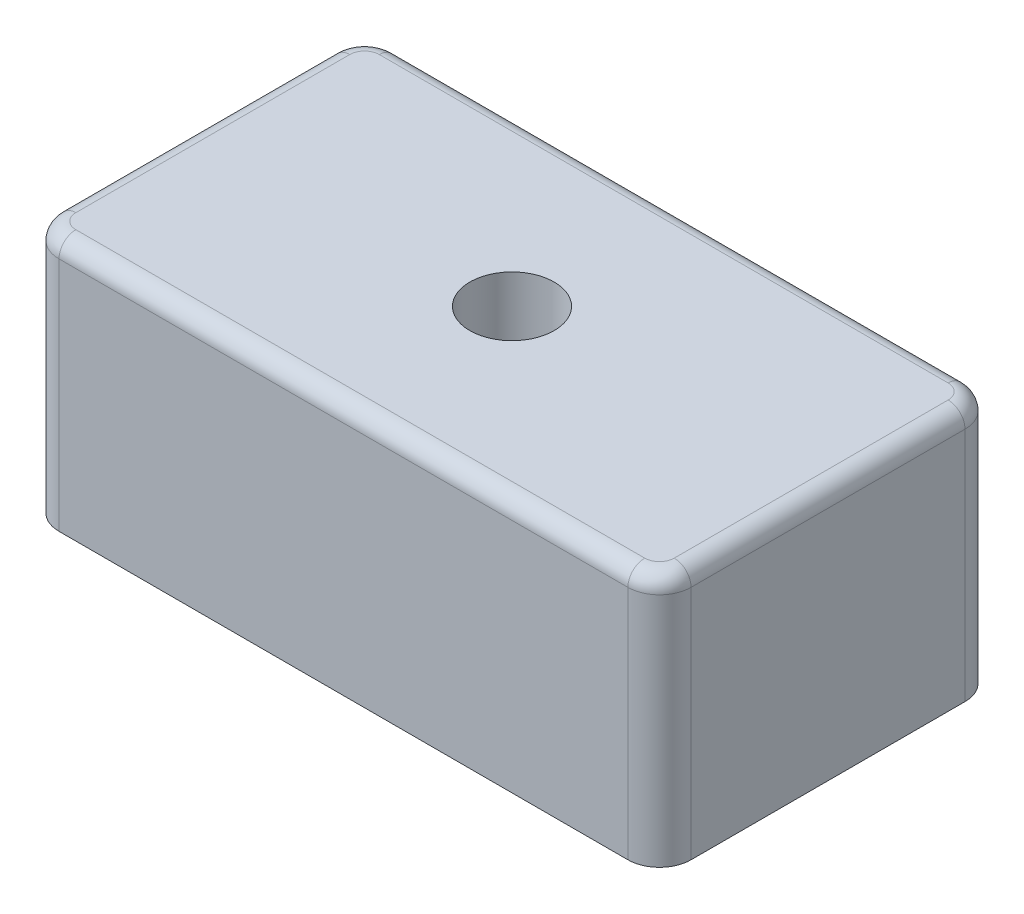
ISO-10303-21;
HEADER;
FILE_DESCRIPTION(('STEP AP214'),'2;1');
FILE_NAME('part.step','',(''),(''),'','','');
FILE_SCHEMA(('AUTOMOTIVE_DESIGN { 1 0 10303 214 1 1 1 1 }'));
ENDSEC;
DATA;
#1=APPLICATION_CONTEXT('core data for automotive mechanical design processes');
#2=APPLICATION_PROTOCOL_DEFINITION('international standard','automotive_design',2000,#1);
#3=PRODUCT_CONTEXT('',#1,'mechanical');
#4=PRODUCT('Part','Part','',(#3));
#5=PRODUCT_RELATED_PRODUCT_CATEGORY('part','',(#4));
#6=PRODUCT_DEFINITION_FORMATION('','',#4);
#7=PRODUCT_DEFINITION_CONTEXT('part definition',#1,'design');
#8=PRODUCT_DEFINITION('design','',#6,#7);
#9=PRODUCT_DEFINITION_SHAPE('','',#8);
#10=(LENGTH_UNIT() NAMED_UNIT(*) SI_UNIT(.MILLI.,.METRE.));
#11=(NAMED_UNIT(*) PLANE_ANGLE_UNIT() SI_UNIT($,.RADIAN.));
#12=(NAMED_UNIT(*) SI_UNIT($,.STERADIAN.) SOLID_ANGLE_UNIT());
#13=UNCERTAINTY_MEASURE_WITH_UNIT(LENGTH_MEASURE(1.E-05),#10,'distance_accuracy_value','');
#14=(GEOMETRIC_REPRESENTATION_CONTEXT(3) GLOBAL_UNCERTAINTY_ASSIGNED_CONTEXT((#13)) GLOBAL_UNIT_ASSIGNED_CONTEXT((#10,
#11,#12)) REPRESENTATION_CONTEXT('',''));
#15=CARTESIAN_POINT('',(0.,0.,0.));
#16=DIRECTION('',(0.,0.,1.));
#17=DIRECTION('',(1.,0.,0.));
#18=AXIS2_PLACEMENT_3D('',#15,#16,#17);
#19=CARTESIAN_POINT('',(15.,12.,-8.));
#20=DIRECTION('',(-1.,0.,0.));
#21=DIRECTION('',(0.,0.,1.));
#22=AXIS2_PLACEMENT_3D('',#19,#20,#21);
#23=PLANE('',#22);
#24=DIRECTION('',(0.,-1.,0.));
#25=VECTOR('',#24,1.);
#26=CARTESIAN_POINT('',(15.,12.,-6.5));
#27=LINE('',#26,#25);
#28=CARTESIAN_POINT('',(15.,0.,-6.5));
#29=VERTEX_POINT('',#28);
#30=CARTESIAN_POINT('',(15.,11.2,-6.5));
#31=VERTEX_POINT('',#30);
#32=EDGE_CURVE('E179',#29,#31,#27,.F.);
#33=ORIENTED_EDGE('',*,*,#32,.T.);
#34=DIRECTION('',(0.,0.,-1.));
#35=VECTOR('',#34,1.);
#36=CARTESIAN_POINT('',(15.,11.2,6.5));
#37=LINE('',#36,#35);
#38=CARTESIAN_POINT('',(15.,11.2,6.5));
#39=VERTEX_POINT('',#38);
#40=EDGE_CURVE('E50',#31,#39,#37,.F.);
#41=ORIENTED_EDGE('',*,*,#40,.T.);
#42=DIRECTION('',(0.,-1.,0.));
#43=VECTOR('',#42,1.);
#44=CARTESIAN_POINT('',(15.,12.,6.5));
#45=LINE('',#44,#43);
#46=CARTESIAN_POINT('',(15.,0.,6.5));
#47=VERTEX_POINT('',#46);
#48=EDGE_CURVE('E177',#39,#47,#45,.T.);
#49=ORIENTED_EDGE('',*,*,#48,.T.);
#50=DIRECTION('',(0.,0.,-1.));
#51=VECTOR('',#50,1.);
#52=CARTESIAN_POINT('',(15.,0.,-8.));
#53=LINE('',#52,#51);
#54=EDGE_CURVE('E241',#47,#29,#53,.T.);
#55=ORIENTED_EDGE('',*,*,#54,.T.);
#56=EDGE_LOOP('',(#33,#41,#49,#55));
#57=FACE_BOUND('',#56,.T.);
#58=ADVANCED_FACE('F41',(#57),#23,.F.);
#59=CARTESIAN_POINT('',(-15.,12.,-8.));
#60=DIRECTION('',(0.,0.,1.));
#61=DIRECTION('',(1.,0.,0.));
#62=AXIS2_PLACEMENT_3D('',#59,#60,#61);
#63=PLANE('',#62);
#64=DIRECTION('',(0.,-1.,0.));
#65=VECTOR('',#64,1.);
#66=CARTESIAN_POINT('',(-13.5,12.,-8.));
#67=LINE('',#66,#65);
#68=CARTESIAN_POINT('',(-13.5,0.,-8.));
#69=VERTEX_POINT('',#68);
#70=CARTESIAN_POINT('',(-13.5,11.2,-8.));
#71=VERTEX_POINT('',#70);
#72=EDGE_CURVE('E175',#69,#71,#67,.F.);
#73=ORIENTED_EDGE('',*,*,#72,.T.);
#74=DIRECTION('',(-1.,0.,0.));
#75=VECTOR('',#74,1.);
#76=CARTESIAN_POINT('',(13.5,11.2,-8.));
#77=LINE('',#76,#75);
#78=CARTESIAN_POINT('',(13.5,11.2,-8.));
#79=VERTEX_POINT('',#78);
#80=EDGE_CURVE('E11',#71,#79,#77,.F.);
#81=ORIENTED_EDGE('',*,*,#80,.T.);
#82=DIRECTION('',(0.,-1.,0.));
#83=VECTOR('',#82,1.);
#84=CARTESIAN_POINT('',(13.5,12.,-8.));
#85=LINE('',#84,#83);
#86=CARTESIAN_POINT('',(13.5,0.,-8.));
#87=VERTEX_POINT('',#86);
#88=EDGE_CURVE('E173',#79,#87,#85,.T.);
#89=ORIENTED_EDGE('',*,*,#88,.T.);
#90=DIRECTION('',(-1.,0.,0.));
#91=VECTOR('',#90,1.);
#92=CARTESIAN_POINT('',(-15.,0.,-8.));
#93=LINE('',#92,#91);
#94=EDGE_CURVE('E163',#87,#69,#93,.T.);
#95=ORIENTED_EDGE('',*,*,#94,.T.);
#96=EDGE_LOOP('',(#73,#81,#89,#95));
#97=FACE_BOUND('',#96,.T.);
#98=ADVANCED_FACE('F248',(#97),#63,.F.);
#99=CARTESIAN_POINT('',(-15.,12.,-8.));
#100=DIRECTION('',(1.,0.,0.));
#101=DIRECTION('',(0.,0.,-1.));
#102=AXIS2_PLACEMENT_3D('',#99,#100,#101);
#103=PLANE('',#102);
#104=DIRECTION('',(0.,-1.,0.));
#105=VECTOR('',#104,1.);
#106=CARTESIAN_POINT('',(-15.,12.,6.5));
#107=LINE('',#106,#105);
#108=CARTESIAN_POINT('',(-15.,0.,6.5));
#109=VERTEX_POINT('',#108);
#110=CARTESIAN_POINT('',(-15.,11.2,6.5));
#111=VERTEX_POINT('',#110);
#112=EDGE_CURVE('E150',#109,#111,#107,.F.);
#113=ORIENTED_EDGE('',*,*,#112,.T.);
#114=DIRECTION('',(0.,0.,1.));
#115=VECTOR('',#114,1.);
#116=CARTESIAN_POINT('',(-15.,11.2,-6.5));
#117=LINE('',#116,#115);
#118=CARTESIAN_POINT('',(-15.,11.2,-6.5));
#119=VERTEX_POINT('',#118);
#120=EDGE_CURVE('E58',#111,#119,#117,.F.);
#121=ORIENTED_EDGE('',*,*,#120,.T.);
#122=DIRECTION('',(0.,-1.,0.));
#123=VECTOR('',#122,1.);
#124=CARTESIAN_POINT('',(-15.,12.,-6.5));
#125=LINE('',#124,#123);
#126=CARTESIAN_POINT('',(-15.,0.,-6.5));
#127=VERTEX_POINT('',#126);
#128=EDGE_CURVE('E154',#119,#127,#125,.T.);
#129=ORIENTED_EDGE('',*,*,#128,.T.);
#130=DIRECTION('',(0.,0.,1.));
#131=VECTOR('',#130,1.);
#132=CARTESIAN_POINT('',(-15.,0.,-8.));
#133=LINE('',#132,#131);
#134=EDGE_CURVE('E160',#127,#109,#133,.T.);
#135=ORIENTED_EDGE('',*,*,#134,.T.);
#136=EDGE_LOOP('',(#113,#121,#129,#135));
#137=FACE_BOUND('',#136,.T.);
#138=ADVANCED_FACE('F255',(#137),#103,.F.);
#139=CARTESIAN_POINT('',(-15.,12.,8.));
#140=DIRECTION('',(0.,0.,-1.));
#141=DIRECTION('',(-1.,0.,0.));
#142=AXIS2_PLACEMENT_3D('',#139,#140,#141);
#143=PLANE('',#142);
#144=DIRECTION('',(0.,-1.,0.));
#145=VECTOR('',#144,1.);
#146=CARTESIAN_POINT('',(13.5,12.,8.));
#147=LINE('',#146,#145);
#148=CARTESIAN_POINT('',(13.5,0.,8.));
#149=VERTEX_POINT('',#148);
#150=CARTESIAN_POINT('',(13.5,11.2,8.));
#151=VERTEX_POINT('',#150);
#152=EDGE_CURVE('E145',#149,#151,#147,.F.);
#153=ORIENTED_EDGE('',*,*,#152,.T.);
#154=DIRECTION('',(1.,0.,0.));
#155=VECTOR('',#154,1.);
#156=CARTESIAN_POINT('',(-13.5,11.2,8.));
#157=LINE('',#156,#155);
#158=CARTESIAN_POINT('',(-13.5,11.2,8.));
#159=VERTEX_POINT('',#158);
#160=EDGE_CURVE('E141',#151,#159,#157,.F.);
#161=ORIENTED_EDGE('',*,*,#160,.T.);
#162=DIRECTION('',(0.,-1.,0.));
#163=VECTOR('',#162,1.);
#164=CARTESIAN_POINT('',(-13.5,12.,8.));
#165=LINE('',#164,#163);
#166=CARTESIAN_POINT('',(-13.5,0.,8.));
#167=VERTEX_POINT('',#166);
#168=EDGE_CURVE('E133',#159,#167,#165,.T.);
#169=ORIENTED_EDGE('',*,*,#168,.T.);
#170=DIRECTION('',(1.,0.,0.));
#171=VECTOR('',#170,1.);
#172=CARTESIAN_POINT('',(-15.,0.,8.));
#173=LINE('',#172,#171);
#174=EDGE_CURVE('E138',#167,#149,#173,.T.);
#175=ORIENTED_EDGE('',*,*,#174,.T.);
#176=EDGE_LOOP('',(#153,#161,#169,#175));
#177=FACE_BOUND('',#176,.T.);
#178=ADVANCED_FACE('F136',(#177),#143,.F.);
#179=CARTESIAN_POINT('',(0.,12.,0.));
#180=DIRECTION('',(0.,1.,0.));
#181=DIRECTION('',(0.,0.,1.));
#182=AXIS2_PLACEMENT_3D('',#179,#180,#181);
#183=PLANE('',#182);
#184=CARTESIAN_POINT('',(-13.5,12.,6.5));
#185=DIRECTION('',(0.,1.,0.));
#186=DIRECTION('',(0.,0.,1.));
#187=AXIS2_PLACEMENT_3D('',#184,#185,#186);
#188=CIRCLE('',#187,0.7);
#189=CARTESIAN_POINT('',(-14.2,12.,6.5));
#190=VERTEX_POINT('',#189);
#191=CARTESIAN_POINT('',(-13.5,12.,7.2));
#192=VERTEX_POINT('',#191);
#193=EDGE_CURVE('E193',#190,#192,#188,.T.);
#194=ORIENTED_EDGE('',*,*,#193,.T.);
#195=DIRECTION('',(1.,0.,0.));
#196=VECTOR('',#195,1.);
#197=CARTESIAN_POINT('',(13.5,12.,7.2));
#198=LINE('',#197,#196);
#199=CARTESIAN_POINT('',(13.5,12.,7.2));
#200=VERTEX_POINT('',#199);
#201=EDGE_CURVE('E197',#192,#200,#198,.T.);
#202=ORIENTED_EDGE('',*,*,#201,.T.);
#203=CARTESIAN_POINT('',(13.5,12.,6.5));
#204=DIRECTION('',(0.,1.,0.));
#205=DIRECTION('',(0.,0.,1.));
#206=AXIS2_PLACEMENT_3D('',#203,#204,#205);
#207=CIRCLE('',#206,0.7);
#208=CARTESIAN_POINT('',(14.2,12.,6.5));
#209=VERTEX_POINT('',#208);
#210=EDGE_CURVE('E195',#200,#209,#207,.T.);
#211=ORIENTED_EDGE('',*,*,#210,.T.);
#212=DIRECTION('',(0.,0.,-1.));
#213=VECTOR('',#212,1.);
#214=CARTESIAN_POINT('',(14.2,12.,-6.5));
#215=LINE('',#214,#213);
#216=CARTESIAN_POINT('',(14.2,12.,-6.5));
#217=VERTEX_POINT('',#216);
#218=EDGE_CURVE('E189',#209,#217,#215,.T.);
#219=ORIENTED_EDGE('',*,*,#218,.T.);
#220=CARTESIAN_POINT('',(13.5,12.,-6.5));
#221=DIRECTION('',(0.,1.,0.));
#222=DIRECTION('',(0.,0.,1.));
#223=AXIS2_PLACEMENT_3D('',#220,#221,#222);
#224=CIRCLE('',#223,0.7);
#225=CARTESIAN_POINT('',(13.5,12.,-7.2));
#226=VERTEX_POINT('',#225);
#227=EDGE_CURVE('E186',#217,#226,#224,.T.);
#228=ORIENTED_EDGE('',*,*,#227,.T.);
#229=DIRECTION('',(-1.,0.,0.));
#230=VECTOR('',#229,1.);
#231=CARTESIAN_POINT('',(-13.5,12.,-7.2));
#232=LINE('',#231,#230);
#233=CARTESIAN_POINT('',(-13.5,12.,-7.2));
#234=VERTEX_POINT('',#233);
#235=EDGE_CURVE('E182',#226,#234,#232,.T.);
#236=ORIENTED_EDGE('',*,*,#235,.T.);
#237=CARTESIAN_POINT('',(-13.5,12.,-6.5));
#238=DIRECTION('',(0.,1.,0.));
#239=DIRECTION('',(0.,0.,1.));
#240=AXIS2_PLACEMENT_3D('',#237,#238,#239);
#241=CIRCLE('',#240,0.7);
#242=CARTESIAN_POINT('',(-14.2,12.,-6.5));
#243=VERTEX_POINT('',#242);
#244=EDGE_CURVE('E184',#234,#243,#241,.T.);
#245=ORIENTED_EDGE('',*,*,#244,.T.);
#246=DIRECTION('',(0.,0.,1.));
#247=VECTOR('',#246,1.);
#248=CARTESIAN_POINT('',(-14.2,12.,6.5));
#249=LINE('',#248,#247);
#250=EDGE_CURVE('E191',#243,#190,#249,.T.);
#251=ORIENTED_EDGE('',*,*,#250,.T.);
#252=EDGE_LOOP('',(#194,#202,#211,#219,#228,#236,#245,#251));
#253=FACE_BOUND('',#252,.T.);
#254=CARTESIAN_POINT('',(0.,12.,0.));
#255=DIRECTION('',(0.,1.,0.));
#256=DIRECTION('',(0.,0.,1.));
#257=AXIS2_PLACEMENT_3D('',#254,#255,#256);
#258=CIRCLE('',#257,2.);
#259=CARTESIAN_POINT('',(0.,12.,2.));
#260=VERTEX_POINT('',#259);
#261=EDGE_CURVE('E231',#260,#260,#258,.T.);
#262=ORIENTED_EDGE('',*,*,#261,.F.);
#263=EDGE_LOOP('',(#262));
#264=FACE_BOUND('',#263,.T.);
#265=ADVANCED_FACE('F291',(#253,#264),#183,.T.);
#266=CARTESIAN_POINT('',(0.,0.,0.));
#267=DIRECTION('',(0.,1.,0.));
#268=DIRECTION('',(0.,0.,1.));
#269=AXIS2_PLACEMENT_3D('',#266,#267,#268);
#270=PLANE('',#269);
#271=CARTESIAN_POINT('',(0.,0.,0.));
#272=DIRECTION('',(0.,1.,0.));
#273=DIRECTION('',(0.,0.,1.));
#274=AXIS2_PLACEMENT_3D('',#271,#272,#273);
#275=CIRCLE('',#274,2.);
#276=CARTESIAN_POINT('',(0.,0.,2.));
#277=VERTEX_POINT('',#276);
#278=EDGE_CURVE('E236',#277,#277,#275,.T.);
#279=ORIENTED_EDGE('',*,*,#278,.T.);
#280=EDGE_LOOP('',(#279));
#281=FACE_BOUND('',#280,.T.);
#282=ORIENTED_EDGE('',*,*,#174,.F.);
#283=CARTESIAN_POINT('',(-13.5,0.,6.5));
#284=DIRECTION('',(0.,1.,0.));
#285=DIRECTION('',(0.,0.,1.));
#286=AXIS2_PLACEMENT_3D('',#283,#284,#285);
#287=CIRCLE('',#286,1.5);
#288=EDGE_CURVE('E148',#167,#109,#287,.F.);
#289=ORIENTED_EDGE('',*,*,#288,.T.);
#290=ORIENTED_EDGE('',*,*,#134,.F.);
#291=CARTESIAN_POINT('',(-13.5,0.,-6.5));
#292=DIRECTION('',(0.,1.,0.));
#293=DIRECTION('',(0.,0.,1.));
#294=AXIS2_PLACEMENT_3D('',#291,#292,#293);
#295=CIRCLE('',#294,1.5);
#296=EDGE_CURVE('E155',#127,#69,#295,.F.);
#297=ORIENTED_EDGE('',*,*,#296,.T.);
#298=ORIENTED_EDGE('',*,*,#94,.F.);
#299=CARTESIAN_POINT('',(13.5,0.,-6.5));
#300=DIRECTION('',(0.,1.,0.));
#301=DIRECTION('',(0.,0.,1.));
#302=AXIS2_PLACEMENT_3D('',#299,#300,#301);
#303=CIRCLE('',#302,1.5);
#304=EDGE_CURVE('E168',#87,#29,#303,.F.);
#305=ORIENTED_EDGE('',*,*,#304,.T.);
#306=ORIENTED_EDGE('',*,*,#54,.F.);
#307=CARTESIAN_POINT('',(13.5,0.,6.5));
#308=DIRECTION('',(0.,1.,0.));
#309=DIRECTION('',(0.,0.,1.));
#310=AXIS2_PLACEMENT_3D('',#307,#308,#309);
#311=CIRCLE('',#310,1.5);
#312=EDGE_CURVE('E144',#47,#149,#311,.F.);
#313=ORIENTED_EDGE('',*,*,#312,.T.);
#314=EDGE_LOOP('',(#282,#289,#290,#297,#298,#305,#306,#313));
#315=FACE_BOUND('',#314,.T.);
#316=ADVANCED_FACE('F157',(#281,#315),#270,.F.);
#317=CARTESIAN_POINT('',(0.,0.,0.));
#318=DIRECTION('',(0.,1.,0.));
#319=DIRECTION('',(0.,0.,1.));
#320=AXIS2_PLACEMENT_3D('',#317,#318,#319);
#321=CYLINDRICAL_SURFACE('',#320,2.);
#322=ORIENTED_EDGE('',*,*,#278,.F.);
#323=EDGE_LOOP('',(#322));
#324=FACE_BOUND('',#323,.T.);
#325=ORIENTED_EDGE('',*,*,#261,.T.);
#326=EDGE_LOOP('',(#325));
#327=FACE_BOUND('',#326,.T.);
#328=ADVANCED_FACE('F300',(#324,#327),#321,.F.);
#329=CARTESIAN_POINT('',(-13.5,12.,6.5));
#330=DIRECTION('',(0.,-1.,0.));
#331=DIRECTION('',(0.,0.,-1.));
#332=AXIS2_PLACEMENT_3D('',#329,#330,#331);
#333=CYLINDRICAL_SURFACE('',#332,1.5);
#334=ORIENTED_EDGE('',*,*,#168,.F.);
#335=CARTESIAN_POINT('',(-13.5,11.2,6.5));
#336=DIRECTION('',(0.,1.,0.));
#337=DIRECTION('',(0.,0.,1.));
#338=AXIS2_PLACEMENT_3D('',#335,#336,#337);
#339=CIRCLE('',#338,1.5);
#340=EDGE_CURVE('E204',#159,#111,#339,.F.);
#341=ORIENTED_EDGE('',*,*,#340,.T.);
#342=ORIENTED_EDGE('',*,*,#112,.F.);
#343=ORIENTED_EDGE('',*,*,#288,.F.);
#344=EDGE_LOOP('',(#334,#341,#342,#343));
#345=FACE_BOUND('',#344,.T.);
#346=ADVANCED_FACE('F149',(#345),#333,.T.);
#347=CARTESIAN_POINT('',(-13.5,12.,-6.5));
#348=DIRECTION('',(0.,-1.,0.));
#349=DIRECTION('',(0.,0.,-1.));
#350=AXIS2_PLACEMENT_3D('',#347,#348,#349);
#351=CYLINDRICAL_SURFACE('',#350,1.5);
#352=ORIENTED_EDGE('',*,*,#128,.F.);
#353=CARTESIAN_POINT('',(-13.5,11.2,-6.5));
#354=DIRECTION('',(0.,1.,0.));
#355=DIRECTION('',(0.,0.,1.));
#356=AXIS2_PLACEMENT_3D('',#353,#354,#355);
#357=CIRCLE('',#356,1.5);
#358=EDGE_CURVE('E65',#119,#71,#357,.F.);
#359=ORIENTED_EDGE('',*,*,#358,.T.);
#360=ORIENTED_EDGE('',*,*,#72,.F.);
#361=ORIENTED_EDGE('',*,*,#296,.F.);
#362=EDGE_LOOP('',(#352,#359,#360,#361));
#363=FACE_BOUND('',#362,.T.);
#364=ADVANCED_FACE('F253',(#363),#351,.T.);
#365=CARTESIAN_POINT('',(13.5,12.,-6.5));
#366=DIRECTION('',(0.,-1.,0.));
#367=DIRECTION('',(0.,0.,-1.));
#368=AXIS2_PLACEMENT_3D('',#365,#366,#367);
#369=CYLINDRICAL_SURFACE('',#368,1.5);
#370=ORIENTED_EDGE('',*,*,#88,.F.);
#371=CARTESIAN_POINT('',(13.5,11.2,-6.5));
#372=DIRECTION('',(0.,1.,0.));
#373=DIRECTION('',(0.,0.,1.));
#374=AXIS2_PLACEMENT_3D('',#371,#372,#373);
#375=CIRCLE('',#374,1.5);
#376=EDGE_CURVE('E199',#79,#31,#375,.F.);
#377=ORIENTED_EDGE('',*,*,#376,.T.);
#378=ORIENTED_EDGE('',*,*,#32,.F.);
#379=ORIENTED_EDGE('',*,*,#304,.F.);
#380=EDGE_LOOP('',(#370,#377,#378,#379));
#381=FACE_BOUND('',#380,.T.);
#382=ADVANCED_FACE('F269',(#381),#369,.T.);
#383=CARTESIAN_POINT('',(13.5,12.,6.5));
#384=DIRECTION('',(0.,-1.,0.));
#385=DIRECTION('',(0.,0.,-1.));
#386=AXIS2_PLACEMENT_3D('',#383,#384,#385);
#387=CYLINDRICAL_SURFACE('',#386,1.5);
#388=ORIENTED_EDGE('',*,*,#48,.F.);
#389=CARTESIAN_POINT('',(13.5,11.2,6.5));
#390=DIRECTION('',(0.,1.,0.));
#391=DIRECTION('',(0.,0.,1.));
#392=AXIS2_PLACEMENT_3D('',#389,#390,#391);
#393=CIRCLE('',#392,1.5);
#394=EDGE_CURVE('E202',#39,#151,#393,.F.);
#395=ORIENTED_EDGE('',*,*,#394,.T.);
#396=ORIENTED_EDGE('',*,*,#152,.F.);
#397=ORIENTED_EDGE('',*,*,#312,.F.);
#398=EDGE_LOOP('',(#388,#395,#396,#397));
#399=FACE_BOUND('',#398,.T.);
#400=ADVANCED_FACE('F284',(#399),#387,.T.);
#401=CARTESIAN_POINT('',(-13.5,11.2,6.5));
#402=DIRECTION('',(0.,1.,0.));
#403=DIRECTION('',(0.,0.,1.));
#404=AXIS2_PLACEMENT_3D('',#401,#402,#403);
#405=DEGENERATE_TOROIDAL_SURFACE('',#404,0.7,0.8,.T.);
#406=CARTESIAN_POINT('',(-14.2,11.2,6.5));
#407=DIRECTION('',(0.,0.,-1.));
#408=DIRECTION('',(-1.,0.,0.));
#409=AXIS2_PLACEMENT_3D('',#406,#407,#408);
#410=CIRCLE('',#409,0.8);
#411=EDGE_CURVE('E225',#111,#190,#410,.T.);
#412=ORIENTED_EDGE('',*,*,#411,.F.);
#413=ORIENTED_EDGE('',*,*,#340,.F.);
#414=CARTESIAN_POINT('',(-13.5,11.2,7.2));
#415=DIRECTION('',(1.,0.,0.));
#416=DIRECTION('',(0.,0.,-1.));
#417=AXIS2_PLACEMENT_3D('',#414,#415,#416);
#418=CIRCLE('',#417,0.8);
#419=EDGE_CURVE('E45',#192,#159,#418,.T.);
#420=ORIENTED_EDGE('',*,*,#419,.F.);
#421=ORIENTED_EDGE('',*,*,#193,.F.);
#422=EDGE_LOOP('',(#412,#413,#420,#421));
#423=FACE_BOUND('',#422,.T.);
#424=ADVANCED_FACE('F43',(#423),#405,.T.);
#425=CARTESIAN_POINT('',(0.,11.2,7.2));
#426=DIRECTION('',(-1.,0.,0.));
#427=DIRECTION('',(0.,0.,1.));
#428=AXIS2_PLACEMENT_3D('',#425,#426,#427);
#429=CYLINDRICAL_SURFACE('',#428,0.8);
#430=ORIENTED_EDGE('',*,*,#419,.T.);
#431=ORIENTED_EDGE('',*,*,#160,.F.);
#432=CARTESIAN_POINT('',(13.5,11.2,7.2));
#433=DIRECTION('',(1.,0.,0.));
#434=DIRECTION('',(0.,0.,-1.));
#435=AXIS2_PLACEMENT_3D('',#432,#433,#434);
#436=CIRCLE('',#435,0.8);
#437=EDGE_CURVE('E223',#200,#151,#436,.T.);
#438=ORIENTED_EDGE('',*,*,#437,.F.);
#439=ORIENTED_EDGE('',*,*,#201,.F.);
#440=EDGE_LOOP('',(#430,#431,#438,#439));
#441=FACE_BOUND('',#440,.T.);
#442=ADVANCED_FACE('F289',(#441),#429,.T.);
#443=CARTESIAN_POINT('',(-14.2,11.2,0.));
#444=DIRECTION('',(0.,0.,-1.));
#445=DIRECTION('',(-1.,0.,0.));
#446=AXIS2_PLACEMENT_3D('',#443,#444,#445);
#447=CYLINDRICAL_SURFACE('',#446,0.8);
#448=ORIENTED_EDGE('',*,*,#411,.T.);
#449=ORIENTED_EDGE('',*,*,#250,.F.);
#450=CARTESIAN_POINT('',(-14.2,11.2,-6.5));
#451=DIRECTION('',(0.,0.,-1.));
#452=DIRECTION('',(-1.,0.,0.));
#453=AXIS2_PLACEMENT_3D('',#450,#451,#452);
#454=CIRCLE('',#453,0.8);
#455=EDGE_CURVE('E220',#119,#243,#454,.T.);
#456=ORIENTED_EDGE('',*,*,#455,.F.);
#457=ORIENTED_EDGE('',*,*,#120,.F.);
#458=EDGE_LOOP('',(#448,#449,#456,#457));
#459=FACE_BOUND('',#458,.T.);
#460=ADVANCED_FACE('F258',(#459),#447,.T.);
#461=CARTESIAN_POINT('',(13.5,11.2,6.5));
#462=DIRECTION('',(0.,1.,0.));
#463=DIRECTION('',(0.,0.,1.));
#464=AXIS2_PLACEMENT_3D('',#461,#462,#463);
#465=DEGENERATE_TOROIDAL_SURFACE('',#464,0.7,0.8,.T.);
#466=ORIENTED_EDGE('',*,*,#437,.T.);
#467=ORIENTED_EDGE('',*,*,#394,.F.);
#468=CARTESIAN_POINT('',(14.2,11.2,6.5));
#469=DIRECTION('',(0.,0.,-1.));
#470=DIRECTION('',(-1.,0.,0.));
#471=AXIS2_PLACEMENT_3D('',#468,#469,#470);
#472=CIRCLE('',#471,0.8);
#473=EDGE_CURVE('E217',#209,#39,#472,.T.);
#474=ORIENTED_EDGE('',*,*,#473,.F.);
#475=ORIENTED_EDGE('',*,*,#210,.F.);
#476=EDGE_LOOP('',(#466,#467,#474,#475));
#477=FACE_BOUND('',#476,.T.);
#478=ADVANCED_FACE('F286',(#477),#465,.T.);
#479=CARTESIAN_POINT('',(-13.5,11.2,-6.5));
#480=DIRECTION('',(0.,1.,0.));
#481=DIRECTION('',(0.,0.,1.));
#482=AXIS2_PLACEMENT_3D('',#479,#480,#481);
#483=DEGENERATE_TOROIDAL_SURFACE('',#482,0.7,0.8,.T.);
#484=ORIENTED_EDGE('',*,*,#455,.T.);
#485=ORIENTED_EDGE('',*,*,#244,.F.);
#486=CARTESIAN_POINT('',(-13.5,11.2,-7.2));
#487=DIRECTION('',(1.,0.,0.));
#488=DIRECTION('',(0.,0.,-1.));
#489=AXIS2_PLACEMENT_3D('',#486,#487,#488);
#490=CIRCLE('',#489,0.8);
#491=EDGE_CURVE('E214',#71,#234,#490,.T.);
#492=ORIENTED_EDGE('',*,*,#491,.F.);
#493=ORIENTED_EDGE('',*,*,#358,.F.);
#494=EDGE_LOOP('',(#484,#485,#492,#493));
#495=FACE_BOUND('',#494,.T.);
#496=ADVANCED_FACE('F261',(#495),#483,.T.);
#497=CARTESIAN_POINT('',(14.2,11.2,0.));
#498=DIRECTION('',(0.,0.,1.));
#499=DIRECTION('',(1.,0.,0.));
#500=AXIS2_PLACEMENT_3D('',#497,#498,#499);
#501=CYLINDRICAL_SURFACE('',#500,0.8);
#502=ORIENTED_EDGE('',*,*,#473,.T.);
#503=ORIENTED_EDGE('',*,*,#40,.F.);
#504=CARTESIAN_POINT('',(14.2,11.2,-6.5));
#505=DIRECTION('',(0.,0.,-1.));
#506=DIRECTION('',(-1.,0.,0.));
#507=AXIS2_PLACEMENT_3D('',#504,#505,#506);
#508=CIRCLE('',#507,0.8);
#509=EDGE_CURVE('E212',#217,#31,#508,.T.);
#510=ORIENTED_EDGE('',*,*,#509,.F.);
#511=ORIENTED_EDGE('',*,*,#218,.F.);
#512=EDGE_LOOP('',(#502,#503,#510,#511));
#513=FACE_BOUND('',#512,.T.);
#514=ADVANCED_FACE('F278',(#513),#501,.T.);
#515=CARTESIAN_POINT('',(0.,11.2,-7.2));
#516=DIRECTION('',(1.,0.,0.));
#517=DIRECTION('',(0.,0.,-1.));
#518=AXIS2_PLACEMENT_3D('',#515,#516,#517);
#519=CYLINDRICAL_SURFACE('',#518,0.8);
#520=ORIENTED_EDGE('',*,*,#491,.T.);
#521=ORIENTED_EDGE('',*,*,#235,.F.);
#522=CARTESIAN_POINT('',(13.5,11.2,-7.2));
#523=DIRECTION('',(1.,0.,0.));
#524=DIRECTION('',(0.,0.,-1.));
#525=AXIS2_PLACEMENT_3D('',#522,#523,#524);
#526=CIRCLE('',#525,0.8);
#527=EDGE_CURVE('E210',#79,#226,#526,.T.);
#528=ORIENTED_EDGE('',*,*,#527,.F.);
#529=ORIENTED_EDGE('',*,*,#80,.F.);
#530=EDGE_LOOP('',(#520,#521,#528,#529));
#531=FACE_BOUND('',#530,.T.);
#532=ADVANCED_FACE('F266',(#531),#519,.T.);
#533=CARTESIAN_POINT('',(13.5,11.2,-6.5));
#534=DIRECTION('',(0.,1.,0.));
#535=DIRECTION('',(0.,0.,1.));
#536=AXIS2_PLACEMENT_3D('',#533,#534,#535);
#537=DEGENERATE_TOROIDAL_SURFACE('',#536,0.7,0.8,.T.);
#538=ORIENTED_EDGE('',*,*,#509,.T.);
#539=ORIENTED_EDGE('',*,*,#376,.F.);
#540=ORIENTED_EDGE('',*,*,#527,.T.);
#541=ORIENTED_EDGE('',*,*,#227,.F.);
#542=EDGE_LOOP('',(#538,#539,#540,#541));
#543=FACE_BOUND('',#542,.T.);
#544=ADVANCED_FACE('F272',(#543),#537,.T.);
#545=CLOSED_SHELL('',(#58,#98,#138,#178,#265,#316,#328,#346,#364,#382,#400,#424,#442,#460,#478,
#496,#514,#532,#544));
#546=MANIFOLD_SOLID_BREP('B2',#545);
#547=ADVANCED_BREP_SHAPE_REPRESENTATION('',(#18,#546),#14);
#548=SHAPE_DEFINITION_REPRESENTATION(#9,#547);
ENDSEC;
END-ISO-10303-21;
